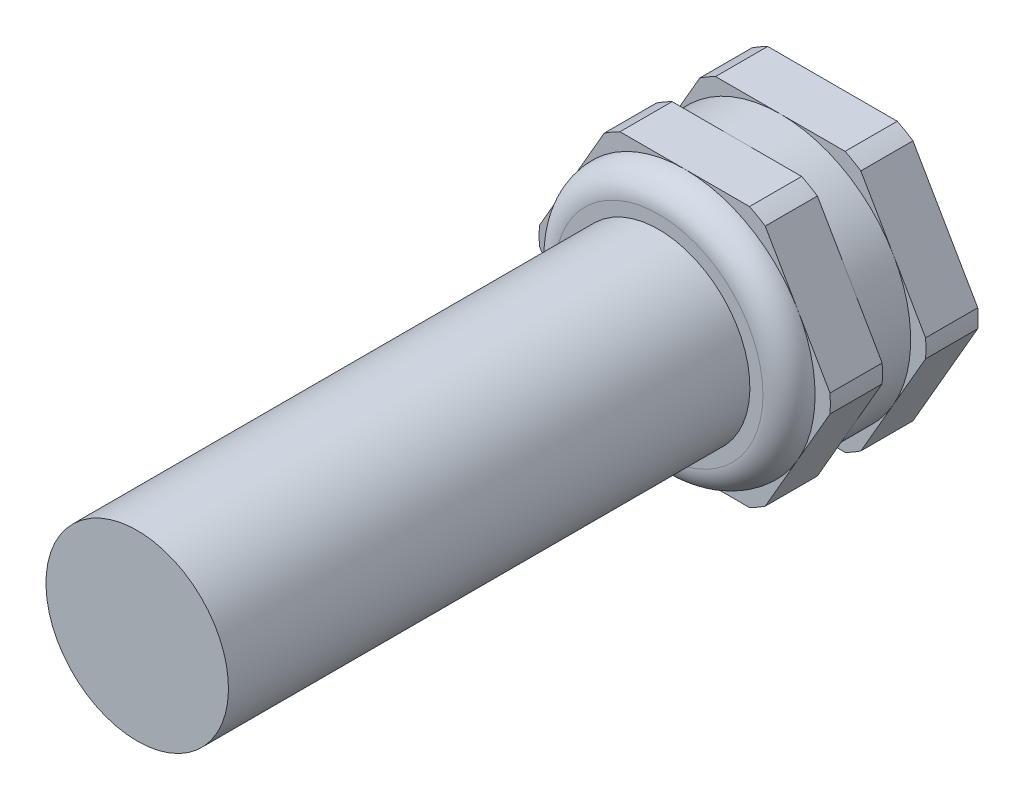
ISO-10303-21;
HEADER;
FILE_DESCRIPTION(('STEP AP214'),'2;1');
FILE_NAME('part.step','',(''),(''),'','','');
FILE_SCHEMA(('AUTOMOTIVE_DESIGN { 1 0 10303 214 1 1 1 1 }'));
ENDSEC;
DATA;
#1=APPLICATION_CONTEXT('core data for automotive mechanical design processes');
#2=APPLICATION_PROTOCOL_DEFINITION('international standard','automotive_design',2000,#1);
#3=PRODUCT_CONTEXT('',#1,'mechanical');
#4=PRODUCT('Part','Part','',(#3));
#5=PRODUCT_RELATED_PRODUCT_CATEGORY('part','',(#4));
#6=PRODUCT_DEFINITION_FORMATION('','',#4);
#7=PRODUCT_DEFINITION_CONTEXT('part definition',#1,'design');
#8=PRODUCT_DEFINITION('design','',#6,#7);
#9=PRODUCT_DEFINITION_SHAPE('','',#8);
#10=(LENGTH_UNIT() NAMED_UNIT(*) SI_UNIT(.MILLI.,.METRE.));
#11=(NAMED_UNIT(*) PLANE_ANGLE_UNIT() SI_UNIT($,.RADIAN.));
#12=(NAMED_UNIT(*) SI_UNIT($,.STERADIAN.) SOLID_ANGLE_UNIT());
#13=UNCERTAINTY_MEASURE_WITH_UNIT(LENGTH_MEASURE(1.E-05),#10,'distance_accuracy_value','');
#14=(GEOMETRIC_REPRESENTATION_CONTEXT(3) GLOBAL_UNCERTAINTY_ASSIGNED_CONTEXT((#13)) GLOBAL_UNIT_ASSIGNED_CONTEXT((#10,
#11,#12)) REPRESENTATION_CONTEXT('',''));
#15=CARTESIAN_POINT('',(0.,0.,0.));
#16=DIRECTION('',(0.,0.,1.));
#17=DIRECTION('',(1.,0.,0.));
#18=AXIS2_PLACEMENT_3D('',#15,#16,#17);
#19=CARTESIAN_POINT('',(18.,0.,17.));
#20=DIRECTION('',(0.,0.,-1.));
#21=DIRECTION('',(-1.,0.,0.));
#22=AXIS2_PLACEMENT_3D('',#19,#20,#21);
#23=PLANE('',#22);
#24=DIRECTION('',(-0.5,0.866025403784439,0.));
#25=VECTOR('',#24,1.);
#26=CARTESIAN_POINT('',(-8.49038105676658,-15.2942286340599,17.));
#27=LINE('',#26,#25);
#28=CARTESIAN_POINT('',(-9.26336817779769,-13.9553756668377,17.));
#29=VERTEX_POINT('',#28);
#30=CARTESIAN_POINT('',(-12.9903810567666,-7.5,17.));
#31=VERTEX_POINT('',#30);
#32=EDGE_CURVE('E275',#29,#31,#27,.T.);
#33=ORIENTED_EDGE('',*,*,#32,.F.);
#34=CARTESIAN_POINT('',(0.,0.,17.));
#35=DIRECTION('',(0.,0.,-1.));
#36=DIRECTION('',(-1.,0.,0.));
#37=AXIS2_PLACEMENT_3D('',#34,#35,#36);
#38=CIRCLE('',#37,16.75);
#39=CARTESIAN_POINT('',(-7.45402575793779,-15.,17.));
#40=VERTEX_POINT('',#39);
#41=EDGE_CURVE('E474',#29,#40,#38,.F.);
#42=ORIENTED_EDGE('',*,*,#41,.T.);
#43=DIRECTION('',(-1.,0.,0.));
#44=VECTOR('',#43,1.);
#45=CARTESIAN_POINT('',(18.,-15.,17.));
#46=LINE('',#45,#44);
#47=CARTESIAN_POINT('',(0.,-15.,17.));
#48=VERTEX_POINT('',#47);
#49=EDGE_CURVE('E297',#48,#40,#46,.T.);
#50=ORIENTED_EDGE('',*,*,#49,.F.);
#51=CARTESIAN_POINT('',(0.,0.,17.));
#52=DIRECTION('',(0.,0.,1.));
#53=DIRECTION('',(1.,0.,0.));
#54=AXIS2_PLACEMENT_3D('',#51,#52,#53);
#55=CIRCLE('',#54,15.);
#56=EDGE_CURVE('E543',#31,#48,#55,.T.);
#57=ORIENTED_EDGE('',*,*,#56,.F.);
#58=EDGE_LOOP('',(#33,#42,#50,#57));
#59=FACE_BOUND('',#58,.T.);
#60=ADVANCED_FACE('F15',(#59),#23,.F.);
#61=DIRECTION('',(0.5,0.866025403784439,0.));
#62=VECTOR('',#61,1.);
#63=CARTESIAN_POINT('',(-8.49038105676658,15.2942286340599,17.));
#64=LINE('',#63,#62);
#65=CARTESIAN_POINT('',(-16.7173939357355,1.04462433316232,17.));
#66=VERTEX_POINT('',#65);
#67=CARTESIAN_POINT('',(-12.9903810567666,7.5,17.));
#68=VERTEX_POINT('',#67);
#69=EDGE_CURVE('E280',#66,#68,#64,.T.);
#70=ORIENTED_EDGE('',*,*,#69,.F.);
#71=CARTESIAN_POINT('',(0.,0.,17.));
#72=DIRECTION('',(0.,0.,-1.));
#73=DIRECTION('',(-1.,0.,0.));
#74=AXIS2_PLACEMENT_3D('',#71,#72,#73);
#75=CIRCLE('',#74,16.75);
#76=CARTESIAN_POINT('',(-16.7173939357355,-1.04462433316232,17.));
#77=VERTEX_POINT('',#76);
#78=EDGE_CURVE('E392',#66,#77,#75,.F.);
#79=ORIENTED_EDGE('',*,*,#78,.T.);
#80=EDGE_CURVE('E272',#31,#77,#27,.T.);
#81=ORIENTED_EDGE('',*,*,#80,.F.);
#82=EDGE_CURVE('E533',#68,#31,#55,.T.);
#83=ORIENTED_EDGE('',*,*,#82,.F.);
#84=EDGE_LOOP('',(#70,#79,#81,#83));
#85=FACE_BOUND('',#84,.T.);
#86=ADVANCED_FACE('F486',(#85),#23,.F.);
#87=DIRECTION('',(1.,0.,0.));
#88=VECTOR('',#87,1.);
#89=CARTESIAN_POINT('',(18.,15.,17.));
#90=LINE('',#89,#88);
#91=CARTESIAN_POINT('',(-7.45402575793779,15.,17.));
#92=VERTEX_POINT('',#91);
#93=CARTESIAN_POINT('',(0.,15.,17.));
#94=VERTEX_POINT('',#93);
#95=EDGE_CURVE('E285',#92,#94,#90,.T.);
#96=ORIENTED_EDGE('',*,*,#95,.F.);
#97=CARTESIAN_POINT('',(0.,0.,17.));
#98=DIRECTION('',(0.,0.,-1.));
#99=DIRECTION('',(-1.,0.,0.));
#100=AXIS2_PLACEMENT_3D('',#97,#98,#99);
#101=CIRCLE('',#100,16.75);
#102=CARTESIAN_POINT('',(-9.26336817779769,13.9553756668377,17.));
#103=VERTEX_POINT('',#102);
#104=EDGE_CURVE('E401',#92,#103,#101,.F.);
#105=ORIENTED_EDGE('',*,*,#104,.T.);
#106=EDGE_CURVE('E277',#68,#103,#64,.T.);
#107=ORIENTED_EDGE('',*,*,#106,.F.);
#108=EDGE_CURVE('E335',#94,#68,#55,.T.);
#109=ORIENTED_EDGE('',*,*,#108,.F.);
#110=EDGE_LOOP('',(#96,#105,#107,#109));
#111=FACE_BOUND('',#110,.T.);
#112=ADVANCED_FACE('F530',(#111),#23,.F.);
#113=DIRECTION('',(0.5,-0.866025403784439,0.));
#114=VECTOR('',#113,1.);
#115=CARTESIAN_POINT('',(17.4903810567666,-0.294228634059949,17.));
#116=LINE('',#115,#114);
#117=CARTESIAN_POINT('',(9.26336817779769,13.9553756668377,17.));
#118=VERTEX_POINT('',#117);
#119=CARTESIAN_POINT('',(12.9903810567666,7.5,17.));
#120=VERTEX_POINT('',#119);
#121=EDGE_CURVE('E290',#118,#120,#116,.T.);
#122=ORIENTED_EDGE('',*,*,#121,.F.);
#123=CARTESIAN_POINT('',(0.,0.,17.));
#124=DIRECTION('',(0.,0.,-1.));
#125=DIRECTION('',(-1.,0.,0.));
#126=AXIS2_PLACEMENT_3D('',#123,#124,#125);
#127=CIRCLE('',#126,16.75);
#128=CARTESIAN_POINT('',(7.45402575793779,15.,17.));
#129=VERTEX_POINT('',#128);
#130=EDGE_CURVE('E411',#118,#129,#127,.F.);
#131=ORIENTED_EDGE('',*,*,#130,.T.);
#132=EDGE_CURVE('E282',#94,#129,#90,.T.);
#133=ORIENTED_EDGE('',*,*,#132,.F.);
#134=EDGE_CURVE('E331',#120,#94,#55,.T.);
#135=ORIENTED_EDGE('',*,*,#134,.F.);
#136=EDGE_LOOP('',(#122,#131,#133,#135));
#137=FACE_BOUND('',#136,.T.);
#138=ADVANCED_FACE('F526',(#137),#23,.F.);
#139=DIRECTION('',(-0.5,-0.866025403784439,0.));
#140=VECTOR('',#139,1.);
#141=CARTESIAN_POINT('',(17.4903810567666,0.294228634059949,17.));
#142=LINE('',#141,#140);
#143=CARTESIAN_POINT('',(16.7173939357355,-1.04462433316232,17.));
#144=VERTEX_POINT('',#143);
#145=CARTESIAN_POINT('',(12.9903810567666,-7.5,17.));
#146=VERTEX_POINT('',#145);
#147=EDGE_CURVE('E295',#144,#146,#142,.T.);
#148=ORIENTED_EDGE('',*,*,#147,.F.);
#149=CARTESIAN_POINT('',(0.,0.,17.));
#150=DIRECTION('',(0.,0.,-1.));
#151=DIRECTION('',(-1.,0.,0.));
#152=AXIS2_PLACEMENT_3D('',#149,#150,#151);
#153=CIRCLE('',#152,16.75);
#154=CARTESIAN_POINT('',(16.7173939357355,1.04462433316232,17.));
#155=VERTEX_POINT('',#154);
#156=EDGE_CURVE('E419',#144,#155,#153,.F.);
#157=ORIENTED_EDGE('',*,*,#156,.T.);
#158=EDGE_CURVE('E287',#120,#155,#116,.T.);
#159=ORIENTED_EDGE('',*,*,#158,.F.);
#160=EDGE_CURVE('E330',#146,#120,#55,.T.);
#161=ORIENTED_EDGE('',*,*,#160,.F.);
#162=EDGE_LOOP('',(#148,#157,#159,#161));
#163=FACE_BOUND('',#162,.T.);
#164=ADVANCED_FACE('F551',(#163),#23,.F.);
#165=CARTESIAN_POINT('',(7.45402575793779,-15.,17.));
#166=VERTEX_POINT('',#165);
#167=EDGE_CURVE('E300',#166,#48,#46,.T.);
#168=ORIENTED_EDGE('',*,*,#167,.F.);
#169=CARTESIAN_POINT('',(0.,0.,17.));
#170=DIRECTION('',(0.,0.,-1.));
#171=DIRECTION('',(-1.,0.,0.));
#172=AXIS2_PLACEMENT_3D('',#169,#170,#171);
#173=CIRCLE('',#172,16.75);
#174=CARTESIAN_POINT('',(9.26336817779769,-13.9553756668377,17.));
#175=VERTEX_POINT('',#174);
#176=EDGE_CURVE('E427',#166,#175,#173,.F.);
#177=ORIENTED_EDGE('',*,*,#176,.T.);
#178=EDGE_CURVE('E292',#146,#175,#142,.T.);
#179=ORIENTED_EDGE('',*,*,#178,.F.);
#180=EDGE_CURVE('E540',#48,#146,#55,.T.);
#181=ORIENTED_EDGE('',*,*,#180,.F.);
#182=EDGE_LOOP('',(#168,#177,#179,#181));
#183=FACE_BOUND('',#182,.T.);
#184=ADVANCED_FACE('F550',(#183),#23,.F.);
#185=CARTESIAN_POINT('',(18.,0.,11.));
#186=DIRECTION('',(0.,0.,1.));
#187=DIRECTION('',(1.,0.,0.));
#188=AXIS2_PLACEMENT_3D('',#185,#186,#187);
#189=PLANE('',#188);
#190=DIRECTION('',(0.5,0.866025403784439,0.));
#191=VECTOR('',#190,1.);
#192=CARTESIAN_POINT('',(17.4903810567666,0.294228634059949,11.));
#193=LINE('',#192,#191);
#194=CARTESIAN_POINT('',(9.26336817779769,-13.9553756668377,11.));
#195=VERTEX_POINT('',#194);
#196=CARTESIAN_POINT('',(12.9903810567666,-7.5,11.));
#197=VERTEX_POINT('',#196);
#198=EDGE_CURVE('E339',#195,#197,#193,.T.);
#199=ORIENTED_EDGE('',*,*,#198,.F.);
#200=CARTESIAN_POINT('',(0.,0.,11.));
#201=DIRECTION('',(0.,0.,1.));
#202=DIRECTION('',(1.,0.,0.));
#203=AXIS2_PLACEMENT_3D('',#200,#201,#202);
#204=CIRCLE('',#203,16.75);
#205=CARTESIAN_POINT('',(7.45402575793779,-15.,11.));
#206=VERTEX_POINT('',#205);
#207=EDGE_CURVE('E422',#195,#206,#204,.F.);
#208=ORIENTED_EDGE('',*,*,#207,.T.);
#209=DIRECTION('',(1.,0.,0.));
#210=VECTOR('',#209,1.);
#211=CARTESIAN_POINT('',(18.,-15.,11.));
#212=LINE('',#211,#210);
#213=CARTESIAN_POINT('',(0.,-15.,11.));
#214=VERTEX_POINT('',#213);
#215=EDGE_CURVE('E334',#214,#206,#212,.T.);
#216=ORIENTED_EDGE('',*,*,#215,.F.);
#217=CARTESIAN_POINT('',(0.,0.,11.));
#218=DIRECTION('',(0.,0.,1.));
#219=DIRECTION('',(1.,0.,0.));
#220=AXIS2_PLACEMENT_3D('',#217,#218,#219);
#221=CIRCLE('',#220,15.);
#222=EDGE_CURVE('E494',#214,#197,#221,.T.);
#223=ORIENTED_EDGE('',*,*,#222,.T.);
#224=EDGE_LOOP('',(#199,#208,#216,#223));
#225=FACE_BOUND('',#224,.T.);
#226=ADVANCED_FACE('F572',(#225),#189,.F.);
#227=DIRECTION('',(-0.5,0.866025403784439,0.));
#228=VECTOR('',#227,1.);
#229=CARTESIAN_POINT('',(17.4903810567666,-0.294228634059949,11.));
#230=LINE('',#229,#228);
#231=CARTESIAN_POINT('',(16.7173939357355,1.04462433316232,11.));
#232=VERTEX_POINT('',#231);
#233=CARTESIAN_POINT('',(12.9903810567666,7.5,11.));
#234=VERTEX_POINT('',#233);
#235=EDGE_CURVE('E346',#232,#234,#230,.T.);
#236=ORIENTED_EDGE('',*,*,#235,.F.);
#237=CARTESIAN_POINT('',(0.,0.,11.));
#238=DIRECTION('',(0.,0.,1.));
#239=DIRECTION('',(1.,0.,0.));
#240=AXIS2_PLACEMENT_3D('',#237,#238,#239);
#241=CIRCLE('',#240,16.75);
#242=CARTESIAN_POINT('',(16.7173939357355,-1.04462433316232,11.));
#243=VERTEX_POINT('',#242);
#244=EDGE_CURVE('E414',#232,#243,#241,.F.);
#245=ORIENTED_EDGE('',*,*,#244,.T.);
#246=EDGE_CURVE('E342',#197,#243,#193,.T.);
#247=ORIENTED_EDGE('',*,*,#246,.F.);
#248=EDGE_CURVE('E322',#197,#234,#221,.T.);
#249=ORIENTED_EDGE('',*,*,#248,.T.);
#250=EDGE_LOOP('',(#236,#245,#247,#249));
#251=FACE_BOUND('',#250,.T.);
#252=ADVANCED_FACE('F512',(#251),#189,.F.);
#253=DIRECTION('',(-1.,0.,0.));
#254=VECTOR('',#253,1.);
#255=CARTESIAN_POINT('',(18.,15.,11.));
#256=LINE('',#255,#254);
#257=CARTESIAN_POINT('',(7.45402575793779,15.,11.));
#258=VERTEX_POINT('',#257);
#259=CARTESIAN_POINT('',(0.,15.,11.));
#260=VERTEX_POINT('',#259);
#261=EDGE_CURVE('E240',#258,#260,#256,.T.);
#262=ORIENTED_EDGE('',*,*,#261,.F.);
#263=CARTESIAN_POINT('',(0.,0.,11.));
#264=DIRECTION('',(0.,0.,1.));
#265=DIRECTION('',(1.,0.,0.));
#266=AXIS2_PLACEMENT_3D('',#263,#264,#265);
#267=CIRCLE('',#266,16.75);
#268=CARTESIAN_POINT('',(9.26336817779769,13.9553756668377,11.));
#269=VERTEX_POINT('',#268);
#270=EDGE_CURVE('E404',#258,#269,#267,.F.);
#271=ORIENTED_EDGE('',*,*,#270,.T.);
#272=EDGE_CURVE('E349',#234,#269,#230,.T.);
#273=ORIENTED_EDGE('',*,*,#272,.F.);
#274=EDGE_CURVE('E317',#234,#260,#221,.T.);
#275=ORIENTED_EDGE('',*,*,#274,.T.);
#276=EDGE_LOOP('',(#262,#271,#273,#275));
#277=FACE_BOUND('',#276,.T.);
#278=ADVANCED_FACE('F515',(#277),#189,.F.);
#279=DIRECTION('',(-0.5,-0.866025403784439,0.));
#280=VECTOR('',#279,1.);
#281=CARTESIAN_POINT('',(-8.49038105676658,15.2942286340599,11.));
#282=LINE('',#281,#280);
#283=CARTESIAN_POINT('',(-9.26336817779769,13.9553756668377,11.));
#284=VERTEX_POINT('',#283);
#285=CARTESIAN_POINT('',(-12.9903810567666,7.5,11.));
#286=VERTEX_POINT('',#285);
#287=EDGE_CURVE('E351',#284,#286,#282,.T.);
#288=ORIENTED_EDGE('',*,*,#287,.F.);
#289=CARTESIAN_POINT('',(0.,0.,11.));
#290=DIRECTION('',(0.,0.,1.));
#291=DIRECTION('',(1.,0.,0.));
#292=AXIS2_PLACEMENT_3D('',#289,#290,#291);
#293=CIRCLE('',#292,16.75);
#294=CARTESIAN_POINT('',(-7.45402575793779,15.,11.));
#295=VERTEX_POINT('',#294);
#296=EDGE_CURVE('E389',#284,#295,#293,.F.);
#297=ORIENTED_EDGE('',*,*,#296,.T.);
#298=EDGE_CURVE('E352',#260,#295,#256,.T.);
#299=ORIENTED_EDGE('',*,*,#298,.F.);
#300=EDGE_CURVE('E321',#260,#286,#221,.T.);
#301=ORIENTED_EDGE('',*,*,#300,.T.);
#302=EDGE_LOOP('',(#288,#297,#299,#301));
#303=FACE_BOUND('',#302,.T.);
#304=ADVANCED_FACE('F388',(#303),#189,.F.);
#305=DIRECTION('',(0.5,-0.866025403784439,0.));
#306=VECTOR('',#305,1.);
#307=CARTESIAN_POINT('',(-8.49038105676658,-15.2942286340599,11.));
#308=LINE('',#307,#306);
#309=CARTESIAN_POINT('',(-16.7173939357355,-1.04462433316232,11.));
#310=VERTEX_POINT('',#309);
#311=CARTESIAN_POINT('',(-12.9903810567666,-7.5,11.));
#312=VERTEX_POINT('',#311);
#313=EDGE_CURVE('E345',#310,#312,#308,.T.);
#314=ORIENTED_EDGE('',*,*,#313,.F.);
#315=CARTESIAN_POINT('',(0.,0.,11.));
#316=DIRECTION('',(0.,0.,1.));
#317=DIRECTION('',(1.,0.,0.));
#318=AXIS2_PLACEMENT_3D('',#315,#316,#317);
#319=CIRCLE('',#318,16.75);
#320=CARTESIAN_POINT('',(-16.7173939357355,1.04462433316233,11.));
#321=VERTEX_POINT('',#320);
#322=EDGE_CURVE('E378',#310,#321,#319,.F.);
#323=ORIENTED_EDGE('',*,*,#322,.T.);
#324=EDGE_CURVE('E348',#286,#321,#282,.T.);
#325=ORIENTED_EDGE('',*,*,#324,.F.);
#326=EDGE_CURVE('E377',#286,#312,#221,.T.);
#327=ORIENTED_EDGE('',*,*,#326,.T.);
#328=EDGE_LOOP('',(#314,#323,#325,#327));
#329=FACE_BOUND('',#328,.T.);
#330=ADVANCED_FACE('F376',(#329),#189,.F.);
#331=CARTESIAN_POINT('',(-7.45402575793779,-15.,11.));
#332=VERTEX_POINT('',#331);
#333=EDGE_CURVE('E338',#332,#214,#212,.T.);
#334=ORIENTED_EDGE('',*,*,#333,.F.);
#335=CARTESIAN_POINT('',(0.,0.,11.));
#336=DIRECTION('',(0.,0.,1.));
#337=DIRECTION('',(1.,0.,0.));
#338=AXIS2_PLACEMENT_3D('',#335,#336,#337);
#339=CIRCLE('',#338,16.75);
#340=CARTESIAN_POINT('',(-9.26336817779768,-13.9553756668377,11.));
#341=VERTEX_POINT('',#340);
#342=EDGE_CURVE('E467',#332,#341,#339,.F.);
#343=ORIENTED_EDGE('',*,*,#342,.T.);
#344=EDGE_CURVE('E341',#312,#341,#308,.T.);
#345=ORIENTED_EDGE('',*,*,#344,.F.);
#346=EDGE_CURVE('E387',#312,#214,#221,.T.);
#347=ORIENTED_EDGE('',*,*,#346,.T.);
#348=EDGE_LOOP('',(#334,#343,#345,#347));
#349=FACE_BOUND('',#348,.T.);
#350=ADVANCED_FACE('F506',(#349),#189,.F.);
#351=CARTESIAN_POINT('',(15.,0.,6.));
#352=DIRECTION('',(0.,0.,-1.));
#353=DIRECTION('',(-1.,0.,0.));
#354=AXIS2_PLACEMENT_3D('',#351,#352,#353);
#355=PLANE('',#354);
#356=DIRECTION('',(-0.5,0.866025403784439,0.));
#357=VECTOR('',#356,1.);
#358=CARTESIAN_POINT('',(-9.24038105676658,-13.9951905283833,6.));
#359=LINE('',#358,#357);
#360=CARTESIAN_POINT('',(-9.26336817779769,-13.9553756668377,6.));
#361=VERTEX_POINT('',#360);
#362=CARTESIAN_POINT('',(-12.9903810567666,-7.5,6.));
#363=VERTEX_POINT('',#362);
#364=EDGE_CURVE('E276',#361,#363,#359,.T.);
#365=ORIENTED_EDGE('',*,*,#364,.F.);
#366=CARTESIAN_POINT('',(0.,0.,6.));
#367=DIRECTION('',(0.,0.,-1.));
#368=DIRECTION('',(-1.,0.,0.));
#369=AXIS2_PLACEMENT_3D('',#366,#367,#368);
#370=CIRCLE('',#369,16.75);
#371=CARTESIAN_POINT('',(-7.45402575793779,-15.,6.));
#372=VERTEX_POINT('',#371);
#373=EDGE_CURVE('E453',#361,#372,#370,.F.);
#374=ORIENTED_EDGE('',*,*,#373,.T.);
#375=DIRECTION('',(-1.,0.,0.));
#376=VECTOR('',#375,1.);
#377=CARTESIAN_POINT('',(15.,-15.,6.));
#378=LINE('',#377,#376);
#379=CARTESIAN_POINT('',(0.,-15.,6.));
#380=VERTEX_POINT('',#379);
#381=EDGE_CURVE('E271',#380,#372,#378,.T.);
#382=ORIENTED_EDGE('',*,*,#381,.F.);
#383=CARTESIAN_POINT('',(0.,0.,6.));
#384=DIRECTION('',(0.,0.,1.));
#385=DIRECTION('',(1.,0.,0.));
#386=AXIS2_PLACEMENT_3D('',#383,#384,#385);
#387=CIRCLE('',#386,15.);
#388=EDGE_CURVE('E1606',#363,#380,#387,.T.);
#389=ORIENTED_EDGE('',*,*,#388,.F.);
#390=EDGE_LOOP('',(#365,#374,#382,#389));
#391=FACE_BOUND('',#390,.T.);
#392=ADVANCED_FACE('F965',(#391),#355,.F.);
#393=DIRECTION('',(0.5,0.866025403784439,0.));
#394=VECTOR('',#393,1.);
#395=CARTESIAN_POINT('',(-9.24038105676658,13.9951905283833,6.));
#396=LINE('',#395,#394);
#397=CARTESIAN_POINT('',(-16.7173939357355,1.04462433316232,6.));
#398=VERTEX_POINT('',#397);
#399=CARTESIAN_POINT('',(-12.9903810567666,7.5,6.));
#400=VERTEX_POINT('',#399);
#401=EDGE_CURVE('E281',#398,#400,#396,.T.);
#402=ORIENTED_EDGE('',*,*,#401,.F.);
#403=CARTESIAN_POINT('',(0.,0.,6.));
#404=DIRECTION('',(0.,0.,-1.));
#405=DIRECTION('',(-1.,0.,0.));
#406=AXIS2_PLACEMENT_3D('',#403,#404,#405);
#407=CIRCLE('',#406,16.75);
#408=CARTESIAN_POINT('',(-16.7173939357355,-1.04462433316232,6.));
#409=VERTEX_POINT('',#408);
#410=EDGE_CURVE('E451',#398,#409,#407,.F.);
#411=ORIENTED_EDGE('',*,*,#410,.T.);
#412=EDGE_CURVE('E302',#363,#409,#359,.T.);
#413=ORIENTED_EDGE('',*,*,#412,.F.);
#414=EDGE_CURVE('E1613',#400,#363,#387,.T.);
#415=ORIENTED_EDGE('',*,*,#414,.F.);
#416=EDGE_LOOP('',(#402,#411,#413,#415));
#417=FACE_BOUND('',#416,.T.);
#418=ADVANCED_FACE('F1000',(#417),#355,.F.);
#419=DIRECTION('',(1.,0.,0.));
#420=VECTOR('',#419,1.);
#421=CARTESIAN_POINT('',(15.,15.,6.));
#422=LINE('',#421,#420);
#423=CARTESIAN_POINT('',(-7.45402575793779,15.,6.));
#424=VERTEX_POINT('',#423);
#425=CARTESIAN_POINT('',(0.,15.,6.));
#426=VERTEX_POINT('',#425);
#427=EDGE_CURVE('E286',#424,#426,#422,.T.);
#428=ORIENTED_EDGE('',*,*,#427,.F.);
#429=CARTESIAN_POINT('',(0.,0.,6.));
#430=DIRECTION('',(0.,0.,-1.));
#431=DIRECTION('',(-1.,0.,0.));
#432=AXIS2_PLACEMENT_3D('',#429,#430,#431);
#433=CIRCLE('',#432,16.75);
#434=CARTESIAN_POINT('',(-9.26336817779769,13.9553756668377,6.));
#435=VERTEX_POINT('',#434);
#436=EDGE_CURVE('E1621',#424,#435,#433,.F.);
#437=ORIENTED_EDGE('',*,*,#436,.T.);
#438=EDGE_CURVE('E305',#400,#435,#396,.T.);
#439=ORIENTED_EDGE('',*,*,#438,.F.);
#440=EDGE_CURVE('E327',#426,#400,#387,.T.);
#441=ORIENTED_EDGE('',*,*,#440,.F.);
#442=EDGE_LOOP('',(#428,#437,#439,#441));
#443=FACE_BOUND('',#442,.T.);
#444=ADVANCED_FACE('F988',(#443),#355,.F.);
#445=DIRECTION('',(0.5,-0.866025403784439,0.));
#446=VECTOR('',#445,1.);
#447=CARTESIAN_POINT('',(16.7403810567666,1.00480947161671,6.));
#448=LINE('',#447,#446);
#449=CARTESIAN_POINT('',(9.26336817779769,13.9553756668377,6.));
#450=VERTEX_POINT('',#449);
#451=CARTESIAN_POINT('',(12.9903810567666,7.5,6.));
#452=VERTEX_POINT('',#451);
#453=EDGE_CURVE('E291',#450,#452,#448,.T.);
#454=ORIENTED_EDGE('',*,*,#453,.F.);
#455=CARTESIAN_POINT('',(0.,0.,6.));
#456=DIRECTION('',(0.,0.,-1.));
#457=DIRECTION('',(-1.,0.,0.));
#458=AXIS2_PLACEMENT_3D('',#455,#456,#457);
#459=CIRCLE('',#458,16.75);
#460=CARTESIAN_POINT('',(7.45402575793779,15.,6.));
#461=VERTEX_POINT('',#460);
#462=EDGE_CURVE('E1630',#450,#461,#459,.F.);
#463=ORIENTED_EDGE('',*,*,#462,.T.);
#464=EDGE_CURVE('E308',#426,#461,#422,.T.);
#465=ORIENTED_EDGE('',*,*,#464,.F.);
#466=EDGE_CURVE('E323',#452,#426,#387,.T.);
#467=ORIENTED_EDGE('',*,*,#466,.F.);
#468=EDGE_LOOP('',(#454,#463,#465,#467));
#469=FACE_BOUND('',#468,.T.);
#470=ADVANCED_FACE('F976',(#469),#355,.F.);
#471=DIRECTION('',(-0.5,-0.866025403784439,0.));
#472=VECTOR('',#471,1.);
#473=CARTESIAN_POINT('',(16.7403810567666,-1.00480947161671,6.));
#474=LINE('',#473,#472);
#475=CARTESIAN_POINT('',(16.7173939357355,-1.04462433316232,6.));
#476=VERTEX_POINT('',#475);
#477=CARTESIAN_POINT('',(12.9903810567666,-7.5,6.));
#478=VERTEX_POINT('',#477);
#479=EDGE_CURVE('E296',#476,#478,#474,.T.);
#480=ORIENTED_EDGE('',*,*,#479,.F.);
#481=CARTESIAN_POINT('',(0.,0.,6.));
#482=DIRECTION('',(0.,0.,-1.));
#483=DIRECTION('',(-1.,0.,0.));
#484=AXIS2_PLACEMENT_3D('',#481,#482,#483);
#485=CIRCLE('',#484,16.75);
#486=CARTESIAN_POINT('',(16.7173939357355,1.04462433316232,6.));
#487=VERTEX_POINT('',#486);
#488=EDGE_CURVE('E249',#476,#487,#485,.F.);
#489=ORIENTED_EDGE('',*,*,#488,.T.);
#490=EDGE_CURVE('E248',#452,#487,#448,.T.);
#491=ORIENTED_EDGE('',*,*,#490,.F.);
#492=EDGE_CURVE('E320',#478,#452,#387,.T.);
#493=ORIENTED_EDGE('',*,*,#492,.F.);
#494=EDGE_LOOP('',(#480,#489,#491,#493));
#495=FACE_BOUND('',#494,.T.);
#496=ADVANCED_FACE('F962',(#495),#355,.F.);
#497=CARTESIAN_POINT('',(7.45402575793779,-15.,6.));
#498=VERTEX_POINT('',#497);
#499=EDGE_CURVE('E301',#498,#380,#378,.T.);
#500=ORIENTED_EDGE('',*,*,#499,.F.);
#501=CARTESIAN_POINT('',(0.,0.,6.));
#502=DIRECTION('',(0.,0.,-1.));
#503=DIRECTION('',(-1.,0.,0.));
#504=AXIS2_PLACEMENT_3D('',#501,#502,#503);
#505=CIRCLE('',#504,16.75);
#506=CARTESIAN_POINT('',(9.26336817779769,-13.9553756668377,6.));
#507=VERTEX_POINT('',#506);
#508=EDGE_CURVE('E464',#498,#507,#505,.F.);
#509=ORIENTED_EDGE('',*,*,#508,.T.);
#510=EDGE_CURVE('E312',#478,#507,#474,.T.);
#511=ORIENTED_EDGE('',*,*,#510,.F.);
#512=EDGE_CURVE('E1659',#380,#478,#387,.T.);
#513=ORIENTED_EDGE('',*,*,#512,.F.);
#514=EDGE_LOOP('',(#500,#509,#511,#513));
#515=FACE_BOUND('',#514,.T.);
#516=ADVANCED_FACE('F950',(#515),#355,.F.);
#517=CARTESIAN_POINT('',(18.,0.,0.));
#518=DIRECTION('',(0.,0.,1.));
#519=DIRECTION('',(1.,0.,0.));
#520=AXIS2_PLACEMENT_3D('',#517,#518,#519);
#521=PLANE('',#520);
#522=DIRECTION('',(-0.5,-0.866025403784439,0.));
#523=VECTOR('',#522,1.);
#524=CARTESIAN_POINT('',(17.3205080756888,0.,0.));
#525=LINE('',#524,#523);
#526=CARTESIAN_POINT('',(16.7173939357355,-1.04462433316232,0.));
#527=VERTEX_POINT('',#526);
#528=CARTESIAN_POINT('',(9.26336817779769,-13.9553756668377,0.));
#529=VERTEX_POINT('',#528);
#530=EDGE_CURVE('E256',#527,#529,#525,.T.);
#531=ORIENTED_EDGE('',*,*,#530,.T.);
#532=CARTESIAN_POINT('',(0.,0.,0.));
#533=DIRECTION('',(0.,0.,1.));
#534=DIRECTION('',(1.,0.,0.));
#535=AXIS2_PLACEMENT_3D('',#532,#533,#534);
#536=CIRCLE('',#535,16.75);
#537=CARTESIAN_POINT('',(7.45402575793779,-15.,0.));
#538=VERTEX_POINT('',#537);
#539=EDGE_CURVE('E10',#529,#538,#536,.F.);
#540=ORIENTED_EDGE('',*,*,#539,.T.);
#541=DIRECTION('',(-1.,0.,0.));
#542=VECTOR('',#541,1.);
#543=CARTESIAN_POINT('',(8.66025403784439,-15.,0.));
#544=LINE('',#543,#542);
#545=CARTESIAN_POINT('',(-7.45402575793779,-15.,0.));
#546=VERTEX_POINT('',#545);
#547=EDGE_CURVE('E264',#538,#546,#544,.T.);
#548=ORIENTED_EDGE('',*,*,#547,.T.);
#549=CARTESIAN_POINT('',(-9.26336817779769,-13.9553756668377,0.));
#550=VERTEX_POINT('',#549);
#551=EDGE_CURVE('E23',#546,#550,#536,.F.);
#552=ORIENTED_EDGE('',*,*,#551,.T.);
#553=DIRECTION('',(-0.5,0.866025403784439,0.));
#554=VECTOR('',#553,1.);
#555=CARTESIAN_POINT('',(-8.66025403784439,-15.,0.));
#556=LINE('',#555,#554);
#557=CARTESIAN_POINT('',(-16.7173939357355,-1.04462433316232,0.));
#558=VERTEX_POINT('',#557);
#559=EDGE_CURVE('E430',#550,#558,#556,.T.);
#560=ORIENTED_EDGE('',*,*,#559,.T.);
#561=CARTESIAN_POINT('',(-16.7173939357355,1.04462433316232,0.));
#562=VERTEX_POINT('',#561);
#563=EDGE_CURVE('E1666',#558,#562,#536,.F.);
#564=ORIENTED_EDGE('',*,*,#563,.T.);
#565=DIRECTION('',(0.5,0.866025403784439,0.));
#566=VECTOR('',#565,1.);
#567=CARTESIAN_POINT('',(-17.3205080756888,0.,0.));
#568=LINE('',#567,#566);
#569=CARTESIAN_POINT('',(-9.26336817779769,13.9553756668377,0.));
#570=VERTEX_POINT('',#569);
#571=EDGE_CURVE('E262',#562,#570,#568,.T.);
#572=ORIENTED_EDGE('',*,*,#571,.T.);
#573=CARTESIAN_POINT('',(-7.45402575793779,15.,0.));
#574=VERTEX_POINT('',#573);
#575=EDGE_CURVE('E1664',#570,#574,#536,.F.);
#576=ORIENTED_EDGE('',*,*,#575,.T.);
#577=DIRECTION('',(1.,0.,0.));
#578=VECTOR('',#577,1.);
#579=CARTESIAN_POINT('',(-8.66025403784439,15.,0.));
#580=LINE('',#579,#578);
#581=CARTESIAN_POINT('',(7.45402575793779,15.,0.));
#582=VERTEX_POINT('',#581);
#583=EDGE_CURVE('E255',#574,#582,#580,.T.);
#584=ORIENTED_EDGE('',*,*,#583,.T.);
#585=CARTESIAN_POINT('',(9.26336817779769,13.9553756668377,0.));
#586=VERTEX_POINT('',#585);
#587=EDGE_CURVE('E239',#582,#586,#536,.F.);
#588=ORIENTED_EDGE('',*,*,#587,.T.);
#589=DIRECTION('',(0.5,-0.866025403784439,0.));
#590=VECTOR('',#589,1.);
#591=CARTESIAN_POINT('',(8.66025403784439,15.,0.));
#592=LINE('',#591,#590);
#593=CARTESIAN_POINT('',(16.7173939357355,1.04462433316232,0.));
#594=VERTEX_POINT('',#593);
#595=EDGE_CURVE('E246',#586,#594,#592,.T.);
#596=ORIENTED_EDGE('',*,*,#595,.T.);
#597=EDGE_CURVE('E18',#594,#527,#536,.F.);
#598=ORIENTED_EDGE('',*,*,#597,.T.);
#599=EDGE_LOOP('',(#531,#540,#548,#552,#560,#564,#572,#576,#584,#588,#596,#598));
#600=FACE_BOUND('',#599,.T.);
#601=ADVANCED_FACE('F252',(#600),#521,.F.);
#602=CARTESIAN_POINT('',(12.,0.,20.));
#603=DIRECTION('',(0.,0.,-1.));
#604=DIRECTION('',(-1.,0.,0.));
#605=AXIS2_PLACEMENT_3D('',#602,#603,#604);
#606=PLANE('',#605);
#607=CARTESIAN_POINT('',(0.,0.,20.));
#608=DIRECTION('',(0.,0.,-1.));
#609=DIRECTION('',(0.,-1.,0.));
#610=AXIS2_PLACEMENT_3D('',#607,#608,#609);
#611=CIRCLE('',#610,10.5);
#612=CARTESIAN_POINT('',(0.,-10.5,20.));
#613=VERTEX_POINT('',#612);
#614=EDGE_CURVE('E1640',#613,#613,#611,.T.);
#615=ORIENTED_EDGE('',*,*,#614,.T.);
#616=EDGE_LOOP('',(#615));
#617=FACE_BOUND('',#616,.T.);
#618=CARTESIAN_POINT('',(0.,0.,20.));
#619=DIRECTION('',(0.,0.,1.));
#620=DIRECTION('',(1.,0.,0.));
#621=AXIS2_PLACEMENT_3D('',#618,#619,#620);
#622=CIRCLE('',#621,12.);
#623=CARTESIAN_POINT('',(12.,0.,20.));
#624=VERTEX_POINT('',#623);
#625=EDGE_CURVE('E326',#624,#624,#622,.T.);
#626=ORIENTED_EDGE('',*,*,#625,.T.);
#627=EDGE_LOOP('',(#626));
#628=FACE_BOUND('',#627,.T.);
#629=ADVANCED_FACE('F926',(#617,#628),#606,.F.);
#630=CARTESIAN_POINT('',(0.,0.,17.));
#631=DIRECTION('',(0.,0.,1.));
#632=DIRECTION('',(1.,0.,0.));
#633=AXIS2_PLACEMENT_3D('',#630,#631,#632);
#634=TOROIDAL_SURFACE('',#633,12.,3.);
#635=ORIENTED_EDGE('',*,*,#625,.F.);
#636=EDGE_LOOP('',(#635));
#637=FACE_BOUND('',#636,.T.);
#638=ORIENTED_EDGE('',*,*,#134,.T.);
#639=ORIENTED_EDGE('',*,*,#108,.T.);
#640=ORIENTED_EDGE('',*,*,#82,.T.);
#641=ORIENTED_EDGE('',*,*,#56,.T.);
#642=ORIENTED_EDGE('',*,*,#180,.T.);
#643=ORIENTED_EDGE('',*,*,#160,.T.);
#644=EDGE_LOOP('',(#638,#639,#640,#641,#642,#643));
#645=FACE_BOUND('',#644,.T.);
#646=ADVANCED_FACE('F535',(#637,#645),#634,.T.);
#647=CARTESIAN_POINT('',(-8.66025403784439,-15.,54.6991773247094));
#648=DIRECTION('',(-0.866025403784439,-0.5,0.));
#649=DIRECTION('',(0.5,-0.866025403784439,0.));
#650=AXIS2_PLACEMENT_3D('',#647,#648,#649);
#651=PLANE('',#650);
#652=DIRECTION('',(0.,0.,1.));
#653=VECTOR('',#652,1.);
#654=CARTESIAN_POINT('',(-9.26336817779769,-13.9553756668377,-80.));
#655=LINE('',#654,#653);
#656=EDGE_CURVE('E472',#29,#341,#655,.F.);
#657=ORIENTED_EDGE('',*,*,#656,.F.);
#658=ORIENTED_EDGE('',*,*,#32,.T.);
#659=ORIENTED_EDGE('',*,*,#80,.T.);
#660=DIRECTION('',(0.,0.,1.));
#661=VECTOR('',#660,1.);
#662=CARTESIAN_POINT('',(-16.7173939357355,-1.04462433316232,-80.));
#663=LINE('',#662,#661);
#664=EDGE_CURVE('E396',#310,#77,#663,.T.);
#665=ORIENTED_EDGE('',*,*,#664,.F.);
#666=ORIENTED_EDGE('',*,*,#313,.T.);
#667=ORIENTED_EDGE('',*,*,#344,.T.);
#668=EDGE_LOOP('',(#657,#658,#659,#665,#666,#667));
#669=FACE_BOUND('',#668,.T.);
#670=ADVANCED_FACE('F490',(#669),#651,.T.);
#671=CARTESIAN_POINT('',(-17.3205080756888,0.,54.6991773247094));
#672=DIRECTION('',(-0.866025403784439,0.5,0.));
#673=DIRECTION('',(-0.5,-0.866025403784439,0.));
#674=AXIS2_PLACEMENT_3D('',#671,#672,#673);
#675=PLANE('',#674);
#676=DIRECTION('',(0.,0.,1.));
#677=VECTOR('',#676,1.);
#678=CARTESIAN_POINT('',(-16.7173939357355,1.04462433316232,-80.));
#679=LINE('',#678,#677);
#680=EDGE_CURVE('E478',#66,#321,#679,.F.);
#681=ORIENTED_EDGE('',*,*,#680,.F.);
#682=ORIENTED_EDGE('',*,*,#69,.T.);
#683=ORIENTED_EDGE('',*,*,#106,.T.);
#684=DIRECTION('',(0.,0.,1.));
#685=VECTOR('',#684,1.);
#686=CARTESIAN_POINT('',(-9.26336817779769,13.9553756668377,-80.));
#687=LINE('',#686,#685);
#688=EDGE_CURVE('E367',#284,#103,#687,.T.);
#689=ORIENTED_EDGE('',*,*,#688,.F.);
#690=ORIENTED_EDGE('',*,*,#287,.T.);
#691=ORIENTED_EDGE('',*,*,#324,.T.);
#692=EDGE_LOOP('',(#681,#682,#683,#689,#690,#691));
#693=FACE_BOUND('',#692,.T.);
#694=ADVANCED_FACE('F366',(#693),#675,.T.);
#695=CARTESIAN_POINT('',(-8.66025403784439,15.,54.6991773247094));
#696=DIRECTION('',(0.,1.,0.));
#697=DIRECTION('',(-1.,0.,0.));
#698=AXIS2_PLACEMENT_3D('',#695,#696,#697);
#699=PLANE('',#698);
#700=DIRECTION('',(0.,0.,1.));
#701=VECTOR('',#700,1.);
#702=CARTESIAN_POINT('',(-7.45402575793779,15.,-80.));
#703=LINE('',#702,#701);
#704=EDGE_CURVE('E391',#92,#295,#703,.F.);
#705=ORIENTED_EDGE('',*,*,#704,.F.);
#706=ORIENTED_EDGE('',*,*,#95,.T.);
#707=ORIENTED_EDGE('',*,*,#132,.T.);
#708=DIRECTION('',(0.,0.,1.));
#709=VECTOR('',#708,1.);
#710=CARTESIAN_POINT('',(7.45402575793779,15.,-80.));
#711=LINE('',#710,#709);
#712=EDGE_CURVE('E409',#258,#129,#711,.T.);
#713=ORIENTED_EDGE('',*,*,#712,.F.);
#714=ORIENTED_EDGE('',*,*,#261,.T.);
#715=ORIENTED_EDGE('',*,*,#298,.T.);
#716=EDGE_LOOP('',(#705,#706,#707,#713,#714,#715));
#717=FACE_BOUND('',#716,.T.);
#718=ADVANCED_FACE('F519',(#717),#699,.T.);
#719=CARTESIAN_POINT('',(8.66025403784439,15.,54.6991773247094));
#720=DIRECTION('',(0.866025403784439,0.5,0.));
#721=DIRECTION('',(-0.5,0.866025403784439,0.));
#722=AXIS2_PLACEMENT_3D('',#719,#720,#721);
#723=PLANE('',#722);
#724=DIRECTION('',(0.,0.,1.));
#725=VECTOR('',#724,1.);
#726=CARTESIAN_POINT('',(9.26336817779769,13.9553756668377,-80.));
#727=LINE('',#726,#725);
#728=EDGE_CURVE('E407',#118,#269,#727,.F.);
#729=ORIENTED_EDGE('',*,*,#728,.F.);
#730=ORIENTED_EDGE('',*,*,#121,.T.);
#731=ORIENTED_EDGE('',*,*,#158,.T.);
#732=DIRECTION('',(0.,0.,1.));
#733=VECTOR('',#732,1.);
#734=CARTESIAN_POINT('',(16.7173939357355,1.04462433316232,-80.));
#735=LINE('',#734,#733);
#736=EDGE_CURVE('E417',#232,#155,#735,.T.);
#737=ORIENTED_EDGE('',*,*,#736,.F.);
#738=ORIENTED_EDGE('',*,*,#235,.T.);
#739=ORIENTED_EDGE('',*,*,#272,.T.);
#740=EDGE_LOOP('',(#729,#730,#731,#737,#738,#739));
#741=FACE_BOUND('',#740,.T.);
#742=ADVANCED_FACE('F553',(#741),#723,.T.);
#743=CARTESIAN_POINT('',(17.3205080756888,0.,54.6991773247094));
#744=DIRECTION('',(0.866025403784439,-0.5,0.));
#745=DIRECTION('',(0.5,0.866025403784439,0.));
#746=AXIS2_PLACEMENT_3D('',#743,#744,#745);
#747=PLANE('',#746);
#748=DIRECTION('',(0.,0.,1.));
#749=VECTOR('',#748,1.);
#750=CARTESIAN_POINT('',(16.7173939357355,-1.04462433316232,-80.));
#751=LINE('',#750,#749);
#752=EDGE_CURVE('E38',#144,#243,#751,.F.);
#753=ORIENTED_EDGE('',*,*,#752,.F.);
#754=ORIENTED_EDGE('',*,*,#147,.T.);
#755=ORIENTED_EDGE('',*,*,#178,.T.);
#756=DIRECTION('',(0.,0.,1.));
#757=VECTOR('',#756,1.);
#758=CARTESIAN_POINT('',(9.26336817779769,-13.9553756668377,-80.));
#759=LINE('',#758,#757);
#760=EDGE_CURVE('E425',#195,#175,#759,.T.);
#761=ORIENTED_EDGE('',*,*,#760,.F.);
#762=ORIENTED_EDGE('',*,*,#198,.T.);
#763=ORIENTED_EDGE('',*,*,#246,.T.);
#764=EDGE_LOOP('',(#753,#754,#755,#761,#762,#763));
#765=FACE_BOUND('',#764,.T.);
#766=ADVANCED_FACE('F509',(#765),#747,.T.);
#767=CARTESIAN_POINT('',(8.66025403784439,-15.,54.6991773247094));
#768=DIRECTION('',(0.,-1.,0.));
#769=DIRECTION('',(1.,0.,0.));
#770=AXIS2_PLACEMENT_3D('',#767,#768,#769);
#771=PLANE('',#770);
#772=DIRECTION('',(0.,0.,1.));
#773=VECTOR('',#772,1.);
#774=CARTESIAN_POINT('',(7.45402575793779,-15.,-80.));
#775=LINE('',#774,#773);
#776=EDGE_CURVE('E30',#166,#206,#775,.F.);
#777=ORIENTED_EDGE('',*,*,#776,.F.);
#778=ORIENTED_EDGE('',*,*,#167,.T.);
#779=ORIENTED_EDGE('',*,*,#49,.T.);
#780=DIRECTION('',(0.,0.,1.));
#781=VECTOR('',#780,1.);
#782=CARTESIAN_POINT('',(-7.45402575793779,-15.,-80.));
#783=LINE('',#782,#781);
#784=EDGE_CURVE('E470',#332,#40,#783,.T.);
#785=ORIENTED_EDGE('',*,*,#784,.F.);
#786=ORIENTED_EDGE('',*,*,#333,.T.);
#787=ORIENTED_EDGE('',*,*,#215,.T.);
#788=EDGE_LOOP('',(#777,#778,#779,#785,#786,#787));
#789=FACE_BOUND('',#788,.T.);
#790=ADVANCED_FACE('F668',(#789),#771,.T.);
#791=CARTESIAN_POINT('',(0.,0.,54.));
#792=DIRECTION('',(0.,0.,1.));
#793=DIRECTION('',(1.,0.,0.));
#794=AXIS2_PLACEMENT_3D('',#791,#792,#793);
#795=CYLINDRICAL_SURFACE('',#794,15.);
#796=ORIENTED_EDGE('',*,*,#222,.F.);
#797=ORIENTED_EDGE('',*,*,#346,.F.);
#798=ORIENTED_EDGE('',*,*,#326,.F.);
#799=ORIENTED_EDGE('',*,*,#300,.F.);
#800=ORIENTED_EDGE('',*,*,#274,.F.);
#801=ORIENTED_EDGE('',*,*,#248,.F.);
#802=EDGE_LOOP('',(#796,#797,#798,#799,#800,#801));
#803=FACE_BOUND('',#802,.T.);
#804=ORIENTED_EDGE('',*,*,#512,.T.);
#805=ORIENTED_EDGE('',*,*,#492,.T.);
#806=ORIENTED_EDGE('',*,*,#466,.T.);
#807=ORIENTED_EDGE('',*,*,#440,.T.);
#808=ORIENTED_EDGE('',*,*,#414,.T.);
#809=ORIENTED_EDGE('',*,*,#388,.T.);
#810=EDGE_LOOP('',(#804,#805,#806,#807,#808,#809));
#811=FACE_BOUND('',#810,.T.);
#812=ADVANCED_FACE('F383',(#803,#811),#795,.T.);
#813=DIRECTION('',(0.,0.,1.));
#814=VECTOR('',#813,1.);
#815=CARTESIAN_POINT('',(-9.26336817779769,-13.9553756668377,-80.));
#816=LINE('',#815,#814);
#817=EDGE_CURVE('E450',#361,#550,#816,.F.);
#818=ORIENTED_EDGE('',*,*,#817,.F.);
#819=ORIENTED_EDGE('',*,*,#364,.T.);
#820=ORIENTED_EDGE('',*,*,#412,.T.);
#821=DIRECTION('',(0.,0.,1.));
#822=VECTOR('',#821,1.);
#823=CARTESIAN_POINT('',(-16.7173939357355,-1.04462433316232,-80.));
#824=LINE('',#823,#822);
#825=EDGE_CURVE('E456',#558,#409,#824,.T.);
#826=ORIENTED_EDGE('',*,*,#825,.F.);
#827=ORIENTED_EDGE('',*,*,#559,.F.);
#828=EDGE_LOOP('',(#818,#819,#820,#826,#827));
#829=FACE_BOUND('',#828,.T.);
#830=ADVANCED_FACE('F622',(#829),#651,.T.);
#831=DIRECTION('',(0.,0.,1.));
#832=VECTOR('',#831,1.);
#833=CARTESIAN_POINT('',(-16.7173939357355,1.04462433316232,-80.));
#834=LINE('',#833,#832);
#835=EDGE_CURVE('E1616',#398,#562,#834,.F.);
#836=ORIENTED_EDGE('',*,*,#835,.F.);
#837=ORIENTED_EDGE('',*,*,#401,.T.);
#838=ORIENTED_EDGE('',*,*,#438,.T.);
#839=DIRECTION('',(0.,0.,1.));
#840=VECTOR('',#839,1.);
#841=CARTESIAN_POINT('',(-9.26336817779769,13.9553756668377,-80.));
#842=LINE('',#841,#840);
#843=EDGE_CURVE('E1624',#570,#435,#842,.T.);
#844=ORIENTED_EDGE('',*,*,#843,.F.);
#845=ORIENTED_EDGE('',*,*,#571,.F.);
#846=EDGE_LOOP('',(#836,#837,#838,#844,#845));
#847=FACE_BOUND('',#846,.T.);
#848=ADVANCED_FACE('F634',(#847),#675,.T.);
#849=DIRECTION('',(0.,0.,1.));
#850=VECTOR('',#849,1.);
#851=CARTESIAN_POINT('',(-7.45402575793779,15.,-80.));
#852=LINE('',#851,#850);
#853=EDGE_CURVE('E1628',#424,#574,#852,.F.);
#854=ORIENTED_EDGE('',*,*,#853,.F.);
#855=ORIENTED_EDGE('',*,*,#427,.T.);
#856=ORIENTED_EDGE('',*,*,#464,.T.);
#857=DIRECTION('',(0.,0.,1.));
#858=VECTOR('',#857,1.);
#859=CARTESIAN_POINT('',(7.45402575793779,15.,-80.));
#860=LINE('',#859,#858);
#861=EDGE_CURVE('E1633',#582,#461,#860,.T.);
#862=ORIENTED_EDGE('',*,*,#861,.F.);
#863=ORIENTED_EDGE('',*,*,#583,.F.);
#864=EDGE_LOOP('',(#854,#855,#856,#862,#863));
#865=FACE_BOUND('',#864,.T.);
#866=ADVANCED_FACE('F646',(#865),#699,.T.);
#867=DIRECTION('',(0.,0.,1.));
#868=VECTOR('',#867,1.);
#869=CARTESIAN_POINT('',(9.26336817779769,13.9553756668377,-80.));
#870=LINE('',#869,#868);
#871=EDGE_CURVE('E1635',#450,#586,#870,.F.);
#872=ORIENTED_EDGE('',*,*,#871,.F.);
#873=ORIENTED_EDGE('',*,*,#453,.T.);
#874=ORIENTED_EDGE('',*,*,#490,.T.);
#875=DIRECTION('',(0.,0.,1.));
#876=VECTOR('',#875,1.);
#877=CARTESIAN_POINT('',(16.7173939357355,1.04462433316232,-80.));
#878=LINE('',#877,#876);
#879=EDGE_CURVE('E231',#594,#487,#878,.T.);
#880=ORIENTED_EDGE('',*,*,#879,.F.);
#881=ORIENTED_EDGE('',*,*,#595,.F.);
#882=EDGE_LOOP('',(#872,#873,#874,#880,#881));
#883=FACE_BOUND('',#882,.T.);
#884=ADVANCED_FACE('F245',(#883),#723,.T.);
#885=DIRECTION('',(0.,0.,1.));
#886=VECTOR('',#885,1.);
#887=CARTESIAN_POINT('',(16.7173939357355,-1.04462433316232,-80.));
#888=LINE('',#887,#886);
#889=EDGE_CURVE('E234',#476,#527,#888,.F.);
#890=ORIENTED_EDGE('',*,*,#889,.F.);
#891=ORIENTED_EDGE('',*,*,#479,.T.);
#892=ORIENTED_EDGE('',*,*,#510,.T.);
#893=DIRECTION('',(0.,0.,1.));
#894=VECTOR('',#893,1.);
#895=CARTESIAN_POINT('',(9.26336817779769,-13.9553756668377,-80.));
#896=LINE('',#895,#894);
#897=EDGE_CURVE('E462',#529,#507,#896,.T.);
#898=ORIENTED_EDGE('',*,*,#897,.F.);
#899=ORIENTED_EDGE('',*,*,#530,.F.);
#900=EDGE_LOOP('',(#890,#891,#892,#898,#899));
#901=FACE_BOUND('',#900,.T.);
#902=ADVANCED_FACE('F670',(#901),#747,.T.);
#903=DIRECTION('',(0.,0.,1.));
#904=VECTOR('',#903,1.);
#905=CARTESIAN_POINT('',(7.45402575793779,-15.,-80.));
#906=LINE('',#905,#904);
#907=EDGE_CURVE('E444',#498,#538,#906,.F.);
#908=ORIENTED_EDGE('',*,*,#907,.F.);
#909=ORIENTED_EDGE('',*,*,#499,.T.);
#910=ORIENTED_EDGE('',*,*,#381,.T.);
#911=DIRECTION('',(0.,0.,1.));
#912=VECTOR('',#911,1.);
#913=CARTESIAN_POINT('',(-7.45402575793779,-15.,-80.));
#914=LINE('',#913,#912);
#915=EDGE_CURVE('E446',#546,#372,#914,.T.);
#916=ORIENTED_EDGE('',*,*,#915,.F.);
#917=ORIENTED_EDGE('',*,*,#547,.F.);
#918=EDGE_LOOP('',(#908,#909,#910,#916,#917));
#919=FACE_BOUND('',#918,.T.);
#920=ADVANCED_FACE('F443',(#919),#771,.T.);
#921=CARTESIAN_POINT('',(0.,0.,-80.));
#922=DIRECTION('',(0.,0.,1.));
#923=DIRECTION('',(1.,0.,0.));
#924=AXIS2_PLACEMENT_3D('',#921,#922,#923);
#925=CYLINDRICAL_SURFACE('',#924,16.75);
#926=ORIENTED_EDGE('',*,*,#889,.T.);
#927=ORIENTED_EDGE('',*,*,#597,.F.);
#928=ORIENTED_EDGE('',*,*,#879,.T.);
#929=ORIENTED_EDGE('',*,*,#488,.F.);
#930=EDGE_LOOP('',(#926,#927,#928,#929));
#931=FACE_BOUND('',#930,.T.);
#932=ADVANCED_FACE('F230',(#931),#925,.T.);
#933=ORIENTED_EDGE('',*,*,#871,.T.);
#934=ORIENTED_EDGE('',*,*,#587,.F.);
#935=ORIENTED_EDGE('',*,*,#861,.T.);
#936=ORIENTED_EDGE('',*,*,#462,.F.);
#937=EDGE_LOOP('',(#933,#934,#935,#936));
#938=FACE_BOUND('',#937,.T.);
#939=ADVANCED_FACE('F757',(#938),#925,.T.);
#940=ORIENTED_EDGE('',*,*,#853,.T.);
#941=ORIENTED_EDGE('',*,*,#575,.F.);
#942=ORIENTED_EDGE('',*,*,#843,.T.);
#943=ORIENTED_EDGE('',*,*,#436,.F.);
#944=EDGE_LOOP('',(#940,#941,#942,#943));
#945=FACE_BOUND('',#944,.T.);
#946=ADVANCED_FACE('F768',(#945),#925,.T.);
#947=ORIENTED_EDGE('',*,*,#835,.T.);
#948=ORIENTED_EDGE('',*,*,#563,.F.);
#949=ORIENTED_EDGE('',*,*,#825,.T.);
#950=ORIENTED_EDGE('',*,*,#410,.F.);
#951=EDGE_LOOP('',(#947,#948,#949,#950));
#952=FACE_BOUND('',#951,.T.);
#953=ADVANCED_FACE('F780',(#952),#925,.T.);
#954=ORIENTED_EDGE('',*,*,#817,.T.);
#955=ORIENTED_EDGE('',*,*,#551,.F.);
#956=ORIENTED_EDGE('',*,*,#915,.T.);
#957=ORIENTED_EDGE('',*,*,#373,.F.);
#958=EDGE_LOOP('',(#954,#955,#956,#957));
#959=FACE_BOUND('',#958,.T.);
#960=ADVANCED_FACE('F792',(#959),#925,.T.);
#961=ORIENTED_EDGE('',*,*,#907,.T.);
#962=ORIENTED_EDGE('',*,*,#539,.F.);
#963=ORIENTED_EDGE('',*,*,#897,.T.);
#964=ORIENTED_EDGE('',*,*,#508,.F.);
#965=EDGE_LOOP('',(#961,#962,#963,#964));
#966=FACE_BOUND('',#965,.T.);
#967=ADVANCED_FACE('F804',(#966),#925,.T.);
#968=ORIENTED_EDGE('',*,*,#656,.T.);
#969=ORIENTED_EDGE('',*,*,#342,.F.);
#970=ORIENTED_EDGE('',*,*,#784,.T.);
#971=ORIENTED_EDGE('',*,*,#41,.F.);
#972=EDGE_LOOP('',(#968,#969,#970,#971));
#973=FACE_BOUND('',#972,.T.);
#974=ADVANCED_FACE('F815',(#973),#925,.T.);
#975=ORIENTED_EDGE('',*,*,#680,.T.);
#976=ORIENTED_EDGE('',*,*,#322,.F.);
#977=ORIENTED_EDGE('',*,*,#664,.T.);
#978=ORIENTED_EDGE('',*,*,#78,.F.);
#979=EDGE_LOOP('',(#975,#976,#977,#978));
#980=FACE_BOUND('',#979,.T.);
#981=ADVANCED_FACE('F481',(#980),#925,.T.);
#982=ORIENTED_EDGE('',*,*,#704,.T.);
#983=ORIENTED_EDGE('',*,*,#296,.F.);
#984=ORIENTED_EDGE('',*,*,#688,.T.);
#985=ORIENTED_EDGE('',*,*,#104,.F.);
#986=EDGE_LOOP('',(#982,#983,#984,#985));
#987=FACE_BOUND('',#986,.T.);
#988=ADVANCED_FACE('F564',(#987),#925,.T.);
#989=ORIENTED_EDGE('',*,*,#728,.T.);
#990=ORIENTED_EDGE('',*,*,#270,.F.);
#991=ORIENTED_EDGE('',*,*,#712,.T.);
#992=ORIENTED_EDGE('',*,*,#130,.F.);
#993=EDGE_LOOP('',(#989,#990,#991,#992));
#994=FACE_BOUND('',#993,.T.);
#995=ADVANCED_FACE('F518',(#994),#925,.T.);
#996=ORIENTED_EDGE('',*,*,#752,.T.);
#997=ORIENTED_EDGE('',*,*,#244,.F.);
#998=ORIENTED_EDGE('',*,*,#736,.T.);
#999=ORIENTED_EDGE('',*,*,#156,.F.);
#1000=EDGE_LOOP('',(#996,#997,#998,#999));
#1001=FACE_BOUND('',#1000,.T.);
#1002=ADVANCED_FACE('F554',(#1001),#925,.T.);
#1003=ORIENTED_EDGE('',*,*,#776,.T.);
#1004=ORIENTED_EDGE('',*,*,#207,.F.);
#1005=ORIENTED_EDGE('',*,*,#760,.T.);
#1006=ORIENTED_EDGE('',*,*,#176,.F.);
#1007=EDGE_LOOP('',(#1003,#1004,#1005,#1006));
#1008=FACE_BOUND('',#1007,.T.);
#1009=ADVANCED_FACE('F556',(#1008),#925,.T.);
#1010=CARTESIAN_POINT('',(0.,0.,80.));
#1011=DIRECTION('',(0.,0.,-1.));
#1012=DIRECTION('',(-1.,0.,0.));
#1013=AXIS2_PLACEMENT_3D('',#1010,#1011,#1012);
#1014=CYLINDRICAL_SURFACE('',#1013,10.5);
#1015=CARTESIAN_POINT('',(0.,0.,80.));
#1016=DIRECTION('',(0.,0.,-1.));
#1017=DIRECTION('',(0.,-1.,0.));
#1018=AXIS2_PLACEMENT_3D('',#1015,#1016,#1017);
#1019=CIRCLE('',#1018,10.5);
#1020=CARTESIAN_POINT('',(0.,-10.5,80.));
#1021=VERTEX_POINT('',#1020);
#1022=EDGE_CURVE('E1639',#1021,#1021,#1019,.T.);
#1023=ORIENTED_EDGE('',*,*,#1022,.T.);
#1024=EDGE_LOOP('',(#1023));
#1025=FACE_BOUND('',#1024,.T.);
#1026=ORIENTED_EDGE('',*,*,#614,.F.);
#1027=EDGE_LOOP('',(#1026));
#1028=FACE_BOUND('',#1027,.T.);
#1029=ADVANCED_FACE('F563',(#1025,#1028),#1014,.T.);
#1030=CARTESIAN_POINT('',(0.,0.,80.));
#1031=DIRECTION('',(0.,0.,-1.));
#1032=DIRECTION('',(-1.,0.,0.));
#1033=AXIS2_PLACEMENT_3D('',#1030,#1031,#1032);
#1034=PLANE('',#1033);
#1035=ORIENTED_EDGE('',*,*,#1022,.F.);
#1036=EDGE_LOOP('',(#1035));
#1037=FACE_BOUND('',#1036,.T.);
#1038=ADVANCED_FACE('F885',(#1037),#1034,.F.);
#1039=CLOSED_SHELL('',(#60,#86,#112,#138,#164,#184,#226,#252,#278,#304,#330,#350,#392,#418,#444,
#470,#496,#516,#601,#629,#646,#670,#694,#718,#742,#766,#790,#812,#830,#848,#866,#884,#902,#920,
#932,#939,#946,#953,#960,#967,#974,#981,#988,#995,#1002,#1009,#1029,#1038));
#1040=MANIFOLD_SOLID_BREP('B1',#1039);
#1041=ADVANCED_BREP_SHAPE_REPRESENTATION('',(#18,#1040),#14);
#1042=SHAPE_DEFINITION_REPRESENTATION(#9,#1041);
ENDSEC;
END-ISO-10303-21;
